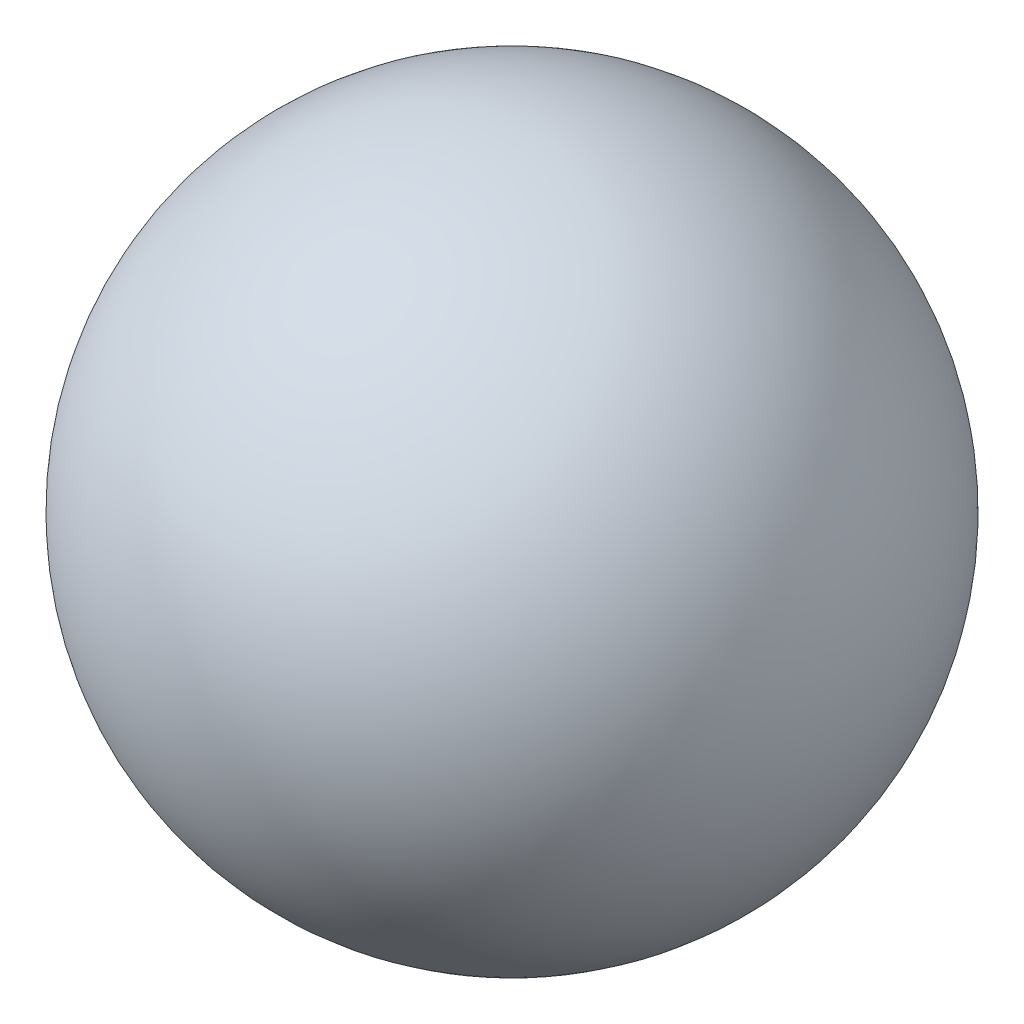
ISO-10303-21;
HEADER;
FILE_DESCRIPTION(('STEP AP214'),'2;1');
FILE_NAME('part.step','',(''),(''),'','','');
FILE_SCHEMA(('AUTOMOTIVE_DESIGN { 1 0 10303 214 1 1 1 1 }'));
ENDSEC;
DATA;
#1=APPLICATION_CONTEXT('core data for automotive mechanical design processes');
#2=APPLICATION_PROTOCOL_DEFINITION('international standard','automotive_design',2000,#1);
#3=PRODUCT_CONTEXT('',#1,'mechanical');
#4=PRODUCT('Part','Part','',(#3));
#5=PRODUCT_RELATED_PRODUCT_CATEGORY('part','',(#4));
#6=PRODUCT_DEFINITION_FORMATION('','',#4);
#7=PRODUCT_DEFINITION_CONTEXT('part definition',#1,'design');
#8=PRODUCT_DEFINITION('design','',#6,#7);
#9=PRODUCT_DEFINITION_SHAPE('','',#8);
#10=(LENGTH_UNIT() NAMED_UNIT(*) SI_UNIT(.MILLI.,.METRE.));
#11=(NAMED_UNIT(*) PLANE_ANGLE_UNIT() SI_UNIT($,.RADIAN.));
#12=(NAMED_UNIT(*) SI_UNIT($,.STERADIAN.) SOLID_ANGLE_UNIT());
#13=UNCERTAINTY_MEASURE_WITH_UNIT(LENGTH_MEASURE(1.E-05),#10,'distance_accuracy_value','');
#14=(GEOMETRIC_REPRESENTATION_CONTEXT(3) GLOBAL_UNCERTAINTY_ASSIGNED_CONTEXT((#13)) GLOBAL_UNIT_ASSIGNED_CONTEXT((#10,
#11,#12)) REPRESENTATION_CONTEXT('',''));
#15=CARTESIAN_POINT('',(0.,0.,0.));
#16=DIRECTION('',(0.,0.,1.));
#17=DIRECTION('',(1.,0.,0.));
#18=AXIS2_PLACEMENT_3D('',#15,#16,#17);
#19=CARTESIAN_POINT('',(0.,0.,0.));
#20=DIRECTION('',(0.,1.,0.));
#21=DIRECTION('',(1.,0.,0.));
#22=AXIS2_PLACEMENT_3D('',#19,#20,#21);
#23=SPHERICAL_SURFACE('',#22,6.4);
#24=CARTESIAN_POINT('',(0.,-6.07947366142827,0.));
#25=DIRECTION('',(0.,1.,0.));
#26=DIRECTION('',(0.,0.,1.));
#27=AXIS2_PLACEMENT_3D('',#24,#25,#26);
#28=CIRCLE('',#27,2.);
#29=CARTESIAN_POINT('',(0.,-6.07947366142827,2.));
#30=VERTEX_POINT('',#29);
#31=EDGE_CURVE('E10',#30,#30,#28,.T.);
#32=ORIENTED_EDGE('',*,*,#31,.T.);
#33=EDGE_LOOP('',(#32));
#34=FACE_BOUND('',#33,.T.);
#35=ADVANCED_FACE('F37',(#34),#23,.T.);
#36=CARTESIAN_POINT('',(0.,-6.4,0.));
#37=DIRECTION('',(0.,1.,0.));
#38=DIRECTION('',(0.,0.,1.));
#39=AXIS2_PLACEMENT_3D('',#36,#37,#38);
#40=CYLINDRICAL_SURFACE('',#39,2.);
#41=CARTESIAN_POINT('',(0.,0.,0.));
#42=DIRECTION('',(0.,1.,0.));
#43=DIRECTION('',(0.,0.,1.));
#44=AXIS2_PLACEMENT_3D('',#41,#42,#43);
#45=CIRCLE('',#44,2.);
#46=CARTESIAN_POINT('',(0.,0.,2.));
#47=VERTEX_POINT('',#46);
#48=EDGE_CURVE('E44',#47,#47,#45,.T.);
#49=ORIENTED_EDGE('',*,*,#48,.T.);
#50=EDGE_LOOP('',(#49));
#51=FACE_BOUND('',#50,.T.);
#52=ORIENTED_EDGE('',*,*,#31,.F.);
#53=EDGE_LOOP('',(#52));
#54=FACE_BOUND('',#53,.T.);
#55=ADVANCED_FACE('F51',(#51,#54),#40,.F.);
#56=CARTESIAN_POINT('',(0.,0.,0.));
#57=DIRECTION('',(0.,1.,0.));
#58=DIRECTION('',(0.,0.,1.));
#59=AXIS2_PLACEMENT_3D('',#56,#57,#58);
#60=PLANE('',#59);
#61=ORIENTED_EDGE('',*,*,#48,.F.);
#62=EDGE_LOOP('',(#61));
#63=FACE_BOUND('',#62,.T.);
#64=ADVANCED_FACE('F54',(#63),#60,.F.);
#65=CLOSED_SHELL('',(#35,#55,#64));
#66=MANIFOLD_SOLID_BREP('B2',#65);
#67=ADVANCED_BREP_SHAPE_REPRESENTATION('',(#18,#66),#14);
#68=SHAPE_DEFINITION_REPRESENTATION(#9,#67);
ENDSEC;
END-ISO-10303-21;
